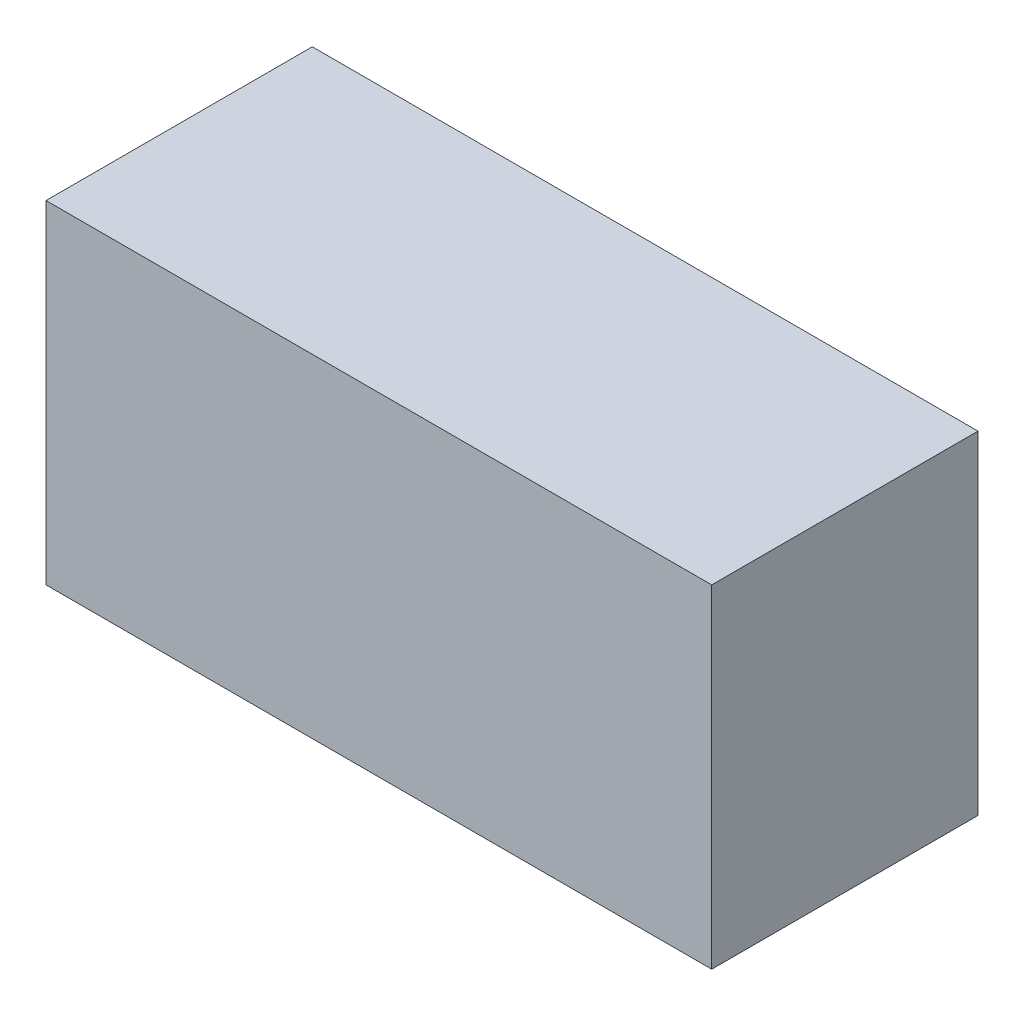
ISO-10303-21;
HEADER;
FILE_DESCRIPTION(('STEP AP214'),'2;1');
FILE_NAME('part.step','',(''),(''),'','','');
FILE_SCHEMA(('AUTOMOTIVE_DESIGN { 1 0 10303 214 1 1 1 1 }'));
ENDSEC;
DATA;
#1=APPLICATION_CONTEXT('core data for automotive mechanical design processes');
#2=APPLICATION_PROTOCOL_DEFINITION('international standard','automotive_design',2000,#1);
#3=PRODUCT_CONTEXT('',#1,'mechanical');
#4=PRODUCT('Part','Part','',(#3));
#5=PRODUCT_RELATED_PRODUCT_CATEGORY('part','',(#4));
#6=PRODUCT_DEFINITION_FORMATION('','',#4);
#7=PRODUCT_DEFINITION_CONTEXT('part definition',#1,'design');
#8=PRODUCT_DEFINITION('design','',#6,#7);
#9=PRODUCT_DEFINITION_SHAPE('','',#8);
#10=(LENGTH_UNIT() NAMED_UNIT(*) SI_UNIT(.MILLI.,.METRE.));
#11=(NAMED_UNIT(*) PLANE_ANGLE_UNIT() SI_UNIT($,.RADIAN.));
#12=(NAMED_UNIT(*) SI_UNIT($,.STERADIAN.) SOLID_ANGLE_UNIT());
#13=UNCERTAINTY_MEASURE_WITH_UNIT(LENGTH_MEASURE(1.E-05),#10,'distance_accuracy_value','');
#14=(GEOMETRIC_REPRESENTATION_CONTEXT(3) GLOBAL_UNCERTAINTY_ASSIGNED_CONTEXT((#13)) GLOBAL_UNIT_ASSIGNED_CONTEXT((#10,
#11,#12)) REPRESENTATION_CONTEXT('',''));
#15=CARTESIAN_POINT('',(0.,0.,0.));
#16=DIRECTION('',(0.,0.,1.));
#17=DIRECTION('',(1.,0.,0.));
#18=AXIS2_PLACEMENT_3D('',#15,#16,#17);
#19=CARTESIAN_POINT('',(-14.0357142857143,3.98214285714285,8.));
#20=DIRECTION('',(1.,0.,0.));
#21=DIRECTION('',(0.,1.,0.));
#22=AXIS2_PLACEMENT_3D('',#19,#20,#21);
#23=PLANE('',#22);
#24=DIRECTION('',(0.,-1.,0.));
#25=VECTOR('',#24,1.);
#26=CARTESIAN_POINT('',(-14.0357142857143,3.98214285714285,0.));
#27=LINE('',#26,#25);
#28=CARTESIAN_POINT('',(-14.0357142857143,3.98214285714285,0.));
#29=VERTEX_POINT('',#28);
#30=CARTESIAN_POINT('',(-14.0357142857143,-6.01785714285715,0.));
#31=VERTEX_POINT('',#30);
#32=EDGE_CURVE('E102',#29,#31,#27,.T.);
#33=ORIENTED_EDGE('',*,*,#32,.T.);
#34=DIRECTION('',(0.,0.,-1.));
#35=VECTOR('',#34,1.);
#36=CARTESIAN_POINT('',(-14.0357142857143,-6.01785714285715,8.));
#37=LINE('',#36,#35);
#38=CARTESIAN_POINT('',(-14.0357142857143,-6.01785714285715,8.));
#39=VERTEX_POINT('',#38);
#40=EDGE_CURVE('E11',#39,#31,#37,.T.);
#41=ORIENTED_EDGE('',*,*,#40,.F.);
#42=DIRECTION('',(0.,-1.,0.));
#43=VECTOR('',#42,1.);
#44=CARTESIAN_POINT('',(-14.0357142857143,3.98214285714285,8.));
#45=LINE('',#44,#43);
#46=CARTESIAN_POINT('',(-14.0357142857143,3.98214285714285,8.));
#47=VERTEX_POINT('',#46);
#48=EDGE_CURVE('E90',#47,#39,#45,.T.);
#49=ORIENTED_EDGE('',*,*,#48,.F.);
#50=DIRECTION('',(0.,0.,-1.));
#51=VECTOR('',#50,1.);
#52=CARTESIAN_POINT('',(-14.0357142857143,3.98214285714285,8.));
#53=LINE('',#52,#51);
#54=EDGE_CURVE('E98',#47,#29,#53,.T.);
#55=ORIENTED_EDGE('',*,*,#54,.T.);
#56=EDGE_LOOP('',(#33,#41,#49,#55));
#57=FACE_BOUND('',#56,.T.);
#58=ADVANCED_FACE('F39',(#57),#23,.F.);
#59=CARTESIAN_POINT('',(-14.0357142857143,-6.01785714285715,8.));
#60=DIRECTION('',(0.,1.,0.));
#61=DIRECTION('',(0.,0.,1.));
#62=AXIS2_PLACEMENT_3D('',#59,#60,#61);
#63=PLANE('',#62);
#64=DIRECTION('',(1.,0.,0.));
#65=VECTOR('',#64,1.);
#66=CARTESIAN_POINT('',(-14.0357142857143,-6.01785714285715,0.));
#67=LINE('',#66,#65);
#68=CARTESIAN_POINT('',(5.96428571428572,-6.01785714285715,0.));
#69=VERTEX_POINT('',#68);
#70=EDGE_CURVE('E94',#31,#69,#67,.T.);
#71=ORIENTED_EDGE('',*,*,#70,.T.);
#72=DIRECTION('',(0.,0.,-1.));
#73=VECTOR('',#72,1.);
#74=CARTESIAN_POINT('',(5.96428571428572,-6.01785714285715,8.));
#75=LINE('',#74,#73);
#76=CARTESIAN_POINT('',(5.96428571428572,-6.01785714285715,8.));
#77=VERTEX_POINT('',#76);
#78=EDGE_CURVE('E47',#77,#69,#75,.T.);
#79=ORIENTED_EDGE('',*,*,#78,.F.);
#80=DIRECTION('',(1.,0.,0.));
#81=VECTOR('',#80,1.);
#82=CARTESIAN_POINT('',(-14.0357142857143,-6.01785714285715,8.));
#83=LINE('',#82,#81);
#84=EDGE_CURVE('E85',#39,#77,#83,.T.);
#85=ORIENTED_EDGE('',*,*,#84,.F.);
#86=ORIENTED_EDGE('',*,*,#40,.T.);
#87=EDGE_LOOP('',(#71,#79,#85,#86));
#88=FACE_BOUND('',#87,.T.);
#89=ADVANCED_FACE('F93',(#88),#63,.F.);
#90=CARTESIAN_POINT('',(5.96428571428572,3.98214285714285,8.));
#91=DIRECTION('',(-1.,0.,0.));
#92=DIRECTION('',(0.,-1.,0.));
#93=AXIS2_PLACEMENT_3D('',#90,#91,#92);
#94=PLANE('',#93);
#95=DIRECTION('',(0.,1.,0.));
#96=VECTOR('',#95,1.);
#97=CARTESIAN_POINT('',(5.96428571428572,3.98214285714285,0.));
#98=LINE('',#97,#96);
#99=CARTESIAN_POINT('',(5.96428571428572,3.98214285714285,0.));
#100=VERTEX_POINT('',#99);
#101=EDGE_CURVE('E72',#69,#100,#98,.T.);
#102=ORIENTED_EDGE('',*,*,#101,.T.);
#103=DIRECTION('',(0.,0.,-1.));
#104=VECTOR('',#103,1.);
#105=CARTESIAN_POINT('',(5.96428571428572,3.98214285714285,8.));
#106=LINE('',#105,#104);
#107=CARTESIAN_POINT('',(5.96428571428572,3.98214285714285,8.));
#108=VERTEX_POINT('',#107);
#109=EDGE_CURVE('E95',#108,#100,#106,.T.);
#110=ORIENTED_EDGE('',*,*,#109,.F.);
#111=DIRECTION('',(0.,1.,0.));
#112=VECTOR('',#111,1.);
#113=CARTESIAN_POINT('',(5.96428571428572,3.98214285714285,8.));
#114=LINE('',#113,#112);
#115=EDGE_CURVE('E88',#77,#108,#114,.T.);
#116=ORIENTED_EDGE('',*,*,#115,.F.);
#117=ORIENTED_EDGE('',*,*,#78,.T.);
#118=EDGE_LOOP('',(#102,#110,#116,#117));
#119=FACE_BOUND('',#118,.T.);
#120=ADVANCED_FACE('F96',(#119),#94,.F.);
#121=CARTESIAN_POINT('',(-14.0357142857143,3.98214285714285,8.));
#122=DIRECTION('',(0.,-1.,0.));
#123=DIRECTION('',(0.,0.,-1.));
#124=AXIS2_PLACEMENT_3D('',#121,#122,#123);
#125=PLANE('',#124);
#126=DIRECTION('',(-1.,0.,0.));
#127=VECTOR('',#126,1.);
#128=CARTESIAN_POINT('',(-14.0357142857143,3.98214285714285,0.));
#129=LINE('',#128,#127);
#130=EDGE_CURVE('E78',#100,#29,#129,.T.);
#131=ORIENTED_EDGE('',*,*,#130,.T.);
#132=ORIENTED_EDGE('',*,*,#54,.F.);
#133=DIRECTION('',(-1.,0.,0.));
#134=VECTOR('',#133,1.);
#135=CARTESIAN_POINT('',(-14.0357142857143,3.98214285714285,8.));
#136=LINE('',#135,#134);
#137=EDGE_CURVE('E55',#108,#47,#136,.T.);
#138=ORIENTED_EDGE('',*,*,#137,.F.);
#139=ORIENTED_EDGE('',*,*,#109,.T.);
#140=EDGE_LOOP('',(#131,#132,#138,#139));
#141=FACE_BOUND('',#140,.T.);
#142=ADVANCED_FACE('F109',(#141),#125,.F.);
#143=CARTESIAN_POINT('',(0.,0.,8.));
#144=DIRECTION('',(0.,0.,1.));
#145=DIRECTION('',(1.,0.,0.));
#146=AXIS2_PLACEMENT_3D('',#143,#144,#145);
#147=PLANE('',#146);
#148=ORIENTED_EDGE('',*,*,#48,.T.);
#149=ORIENTED_EDGE('',*,*,#84,.T.);
#150=ORIENTED_EDGE('',*,*,#115,.T.);
#151=ORIENTED_EDGE('',*,*,#137,.T.);
#152=EDGE_LOOP('',(#148,#149,#150,#151));
#153=FACE_BOUND('',#152,.T.);
#154=ADVANCED_FACE('F86',(#153),#147,.T.);
#155=CARTESIAN_POINT('',(0.,0.,0.));
#156=DIRECTION('',(0.,0.,1.));
#157=DIRECTION('',(1.,0.,0.));
#158=AXIS2_PLACEMENT_3D('',#155,#156,#157);
#159=PLANE('',#158);
#160=ORIENTED_EDGE('',*,*,#32,.F.);
#161=ORIENTED_EDGE('',*,*,#130,.F.);
#162=ORIENTED_EDGE('',*,*,#101,.F.);
#163=ORIENTED_EDGE('',*,*,#70,.F.);
#164=EDGE_LOOP('',(#160,#161,#162,#163));
#165=FACE_BOUND('',#164,.T.);
#166=ADVANCED_FACE('F112',(#165),#159,.F.);
#167=CLOSED_SHELL('',(#58,#89,#120,#142,#154,#166));
#168=MANIFOLD_SOLID_BREP('B2',#167);
#169=ADVANCED_BREP_SHAPE_REPRESENTATION('',(#18,#168),#14);
#170=SHAPE_DEFINITION_REPRESENTATION(#9,#169);
ENDSEC;
END-ISO-10303-21;
